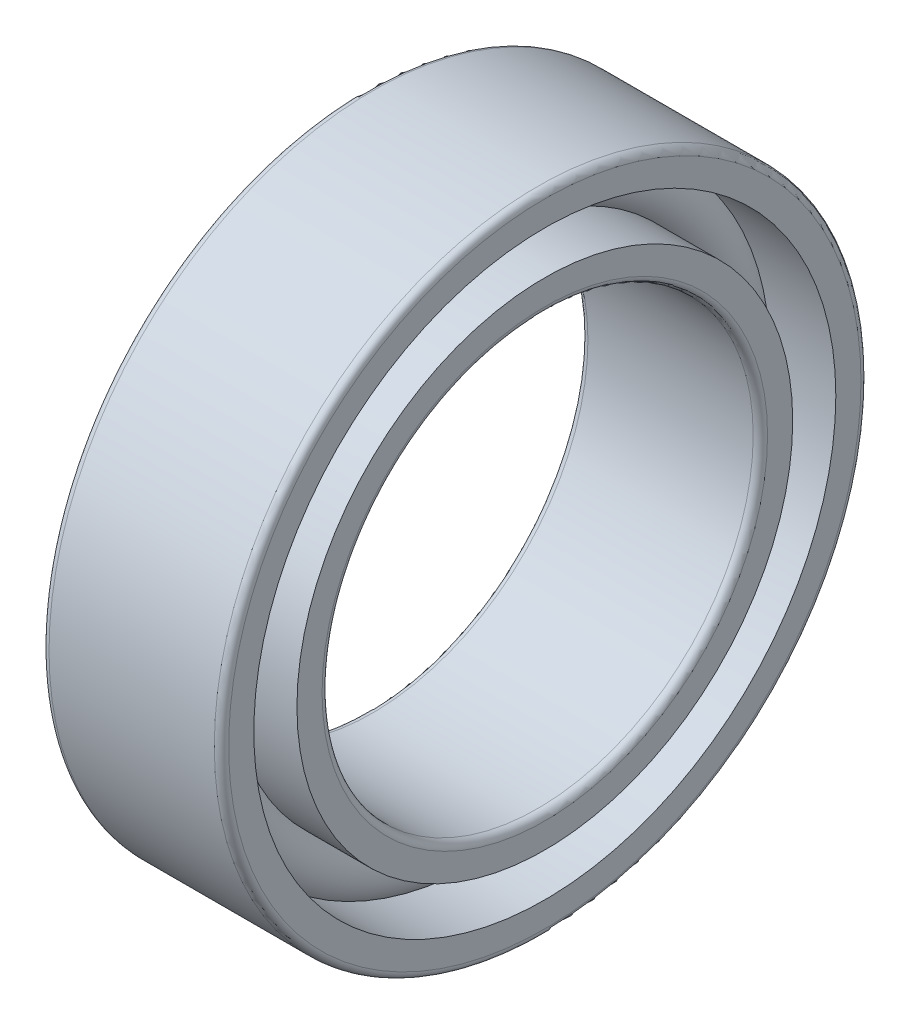
ISO-10303-21;
HEADER;
FILE_DESCRIPTION(('STEP AP214'),'2;1');
FILE_NAME('part.step','',(''),(''),'','','');
FILE_SCHEMA(('AUTOMOTIVE_DESIGN { 1 0 10303 214 1 1 1 1 }'));
ENDSEC;
DATA;
#1=APPLICATION_CONTEXT('core data for automotive mechanical design processes');
#2=APPLICATION_PROTOCOL_DEFINITION('international standard','automotive_design',2000,#1);
#3=PRODUCT_CONTEXT('',#1,'mechanical');
#4=PRODUCT('Part','Part','',(#3));
#5=PRODUCT_RELATED_PRODUCT_CATEGORY('part','',(#4));
#6=PRODUCT_DEFINITION_FORMATION('','',#4);
#7=PRODUCT_DEFINITION_CONTEXT('part definition',#1,'design');
#8=PRODUCT_DEFINITION('design','',#6,#7);
#9=PRODUCT_DEFINITION_SHAPE('','',#8);
#10=(LENGTH_UNIT() NAMED_UNIT(*) SI_UNIT(.MILLI.,.METRE.));
#11=(NAMED_UNIT(*) PLANE_ANGLE_UNIT() SI_UNIT($,.RADIAN.));
#12=(NAMED_UNIT(*) SI_UNIT($,.STERADIAN.) SOLID_ANGLE_UNIT());
#13=UNCERTAINTY_MEASURE_WITH_UNIT(LENGTH_MEASURE(1.E-05),#10,'distance_accuracy_value','');
#14=(GEOMETRIC_REPRESENTATION_CONTEXT(3) GLOBAL_UNCERTAINTY_ASSIGNED_CONTEXT((#13)) GLOBAL_UNIT_ASSIGNED_CONTEXT((#10,
#11,#12)) REPRESENTATION_CONTEXT('',''));
#15=CARTESIAN_POINT('',(0.,0.,0.));
#16=DIRECTION('',(0.,0.,1.));
#17=DIRECTION('',(1.,0.,0.));
#18=AXIS2_PLACEMENT_3D('',#15,#16,#17);
#19=CARTESIAN_POINT('',(-1.80162655706908E-08,0.000298432606224425,-1.31745938614548E-09));
#20=DIRECTION('',(-1.,0.,0.));
#21=DIRECTION('',(0.,0.,1.));
#22=AXIS2_PLACEMENT_3D('',#19,#20,#21);
#23=TOROIDAL_SURFACE('',#22,2.3817391275,0.2858086953);
#24=CARTESIAN_POINT('',(0.213029205734174,0.000298432606224425,-1.31745938614548E-09));
#25=DIRECTION('',(-1.,0.,0.));
#26=DIRECTION('',(0.,0.,1.));
#27=AXIS2_PLACEMENT_3D('',#24,#25,#26);
#28=CIRCLE('',#27,2.5722782577);
#29=CARTESIAN_POINT('',(0.213029205734174,0.000298432606224425,2.57227825638254));
#30=VERTEX_POINT('',#29);
#31=EDGE_CURVE('E42',#30,#30,#28,.F.);
#32=ORIENTED_EDGE('',*,*,#31,.T.);
#33=EDGE_LOOP('',(#32));
#34=FACE_BOUND('',#33,.T.);
#35=CARTESIAN_POINT('',(0.281811156000136,0.000298432606224425,-1.31745938614548E-09));
#36=DIRECTION('',(-1.,0.,0.));
#37=DIRECTION('',(0.,0.,1.));
#38=AXIS2_PLACEMENT_3D('',#35,#36,#37);
#39=CIRCLE('',#38,2.42937391005);
#40=CARTESIAN_POINT('',(0.281811156000833,2.42607115309544,0.132228223211192));
#41=VERTEX_POINT('',#40);
#42=CARTESIAN_POINT('',(0.281811156000136,2.42607115309538,-0.132228225847055));
#43=VERTEX_POINT('',#42);
#44=EDGE_CURVE('E54',#41,#43,#39,.T.);
#45=ORIENTED_EDGE('',*,*,#44,.T.);
#46=CARTESIAN_POINT('',(0.281167144241357,2.42973585569962,-0.132327995103646));
#47=CARTESIAN_POINT('',(0.284100149198315,2.41376618297059,-0.131893517138438));
#48=CARTESIAN_POINT('',(0.285637047352766,2.39754534473115,-0.131449837990503));
#49=CARTESIAN_POINT('',(0.285948333699494,2.36539272467966,-0.130565908961183));
#50=CARTESIAN_POINT('',(0.284775891839199,2.34946145970345,-0.130125760330629));
#51=CARTESIAN_POINT('',(0.280291062901529,2.32107409022271,-0.129337565048585));
#52=CARTESIAN_POINT('',(0.277438443009112,2.30854390709209,-0.128988230972604));
#53=CARTESIAN_POINT('',(0.273742558030363,2.29626817494372,-0.128644523556837));
#54=B_SPLINE_CURVE_WITH_KNOTS('',3,(#46,#47,#48,#49,#50,#51,#52,#53),.UNSPECIFIED.,.F.,.F.,(4,2,
2,4),(0.,0.0486633484844288,0.0963798249911092,0.134830262336285),.UNSPECIFIED.);
#55=CARTESIAN_POINT('',(0.281811156000142,2.33080158799545,-0.129607623914879));
#56=VERTEX_POINT('',#55);
#57=EDGE_CURVE('E81',#43,#56,#54,.T.);
#58=ORIENTED_EDGE('',*,*,#57,.T.);
#59=CARTESIAN_POINT('',(0.281811156000136,0.000298432606224425,-1.31745938614548E-09));
#60=DIRECTION('',(-1.,0.,0.));
#61=DIRECTION('',(0.,0.,1.));
#62=AXIS2_PLACEMENT_3D('',#59,#60,#61);
#63=CIRCLE('',#62,2.33410434495);
#64=CARTESIAN_POINT('',(0.281811156000136,2.33080158799544,0.12960762127997));
#65=VERTEX_POINT('',#64);
#66=EDGE_CURVE('E47',#56,#65,#63,.F.);
#67=ORIENTED_EDGE('',*,*,#66,.T.);
#68=CARTESIAN_POINT('',(0.273742558030363,2.29626817494371,0.128644520921918));
#69=CARTESIAN_POINT('',(0.278428712022317,2.31181398398113,0.129079825714504));
#70=CARTESIAN_POINT('',(0.281755236696182,2.32776426449075,0.12952401154774));
#71=CARTESIAN_POINT('',(0.285630764159104,2.35968396790953,0.130408356608856));
#72=CARTESIAN_POINT('',(0.286232551499178,2.37564697959219,0.130848426016569));
#73=CARTESIAN_POINT('',(0.284923938169938,2.40435664536367,0.131636003282245));
#74=CARTESIAN_POINT('',(0.283478684915354,2.41712592412426,0.131984890796071));
#75=CARTESIAN_POINT('',(0.281167144241359,2.42973585569961,0.132327992468727));
#76=B_SPLINE_CURVE_WITH_KNOTS('',3,(#68,#69,#70,#71,#72,#73,#74,#75),.UNSPECIFIED.,.F.,.F.,(4,2,
2,4),(0.,0.0486633491759087,0.0963798253133486,0.134830262425958),.UNSPECIFIED.);
#77=EDGE_CURVE('E80',#65,#41,#76,.T.);
#78=ORIENTED_EDGE('',*,*,#77,.T.);
#79=EDGE_LOOP('',(#45,#58,#67,#78));
#80=FACE_BOUND('',#79,.T.);
#81=CARTESIAN_POINT('',(0.213029205734176,0.000298432606224425,-1.31745938614548E-09));
#82=DIRECTION('',(-1.,0.,0.));
#83=DIRECTION('',(0.,0.,1.));
#84=AXIS2_PLACEMENT_3D('',#81,#82,#83);
#85=CIRCLE('',#84,2.1911999973);
#86=CARTESIAN_POINT('',(0.213029205734176,0.000298432606224425,2.19119999598254));
#87=VERTEX_POINT('',#86);
#88=EDGE_CURVE('E93',#87,#87,#85,.T.);
#89=ORIENTED_EDGE('',*,*,#88,.T.);
#90=EDGE_LOOP('',(#89));
#91=FACE_BOUND('',#90,.T.);
#92=ADVANCED_FACE('F37',(#34,#80,#91),#23,.T.);
#93=CARTESIAN_POINT('',(-1.80162655706908E-08,2.38203756010622,-1.31745938614548E-09));
#94=DIRECTION('',(1.,0.,0.));
#95=DIRECTION('',(0.,-1.,0.));
#96=AXIS2_PLACEMENT_3D('',#93,#94,#95);
#97=SPHERICAL_SURFACE('',#96,0.31438956483);
#98=ORIENTED_EDGE('',*,*,#57,.F.);
#99=CARTESIAN_POINT('',(-1.80162655706908E-08,2.40939897920294,0.313196664085874));
#100=CARTESIAN_POINT('',(-0.0173115969476488,2.40939923094166,0.313195942687363));
#101=CARTESIAN_POINT('',(-0.034633865728047,2.40958973553445,0.311740024510792));
#102=CARTESIAN_POINT('',(-0.068796002665867,2.41033111358584,0.305954654463721));
#103=CARTESIAN_POINT('',(-0.0856353566222444,2.4108823572935,0.301622250209509));
#104=CARTESIAN_POINT('',(-0.118331987448267,2.41228243774962,0.290212979097694));
#105=CARTESIAN_POINT('',(-0.134189920836021,2.41313107297089,0.283137970420371));
#106=CARTESIAN_POINT('',(-0.164490007648283,2.41503080750561,0.266449511255104));
#107=CARTESIAN_POINT('',(-0.178932415490954,2.41608187033486,0.256836518080921));
#108=CARTESIAN_POINT('',(-0.206084527183535,2.41827593758206,0.235286967569443));
#109=CARTESIAN_POINT('',(-0.218784494501792,2.41941940607635,0.223338191747408));
#110=CARTESIAN_POINT('',(-0.242016552927735,2.42166663269258,0.197488302198498));
#111=CARTESIAN_POINT('',(-0.252548485978641,2.42277038791445,0.183587046253641));
#112=CARTESIAN_POINT('',(-0.271244886738801,2.42482579657287,0.154093256532886));
#113=CARTESIAN_POINT('',(-0.279387973953382,2.42577604409508,0.138487068563399));
#114=CARTESIAN_POINT('',(-0.292965158689501,2.42740729928271,0.106124562405864));
#115=CARTESIAN_POINT('',(-0.298399180026573,2.42808829937622,0.0893682118879696));
#116=CARTESIAN_POINT('',(-0.306433237544128,2.42910830264434,0.055094170538944));
#117=CARTESIAN_POINT('',(-0.309019562575992,2.42944565061817,0.0375732149156469));
#118=CARTESIAN_POINT('',(-0.31124242787047,2.42973507762778,0.00234200759170533));
#119=CARTESIAN_POINT('',(-0.310878942476629,2.4296871533126,-0.0153682457540487));
#120=CARTESIAN_POINT('',(-0.307209687707707,2.42921107320866,-0.0504972455809863));
#121=CARTESIAN_POINT('',(-0.303900464779796,2.42878247111844,-0.0679156254447354));
#122=CARTESIAN_POINT('',(-0.294423413363534,2.42759216979261,-0.101944826941977));
#123=CARTESIAN_POINT('',(-0.288255566110059,2.42683046837041,-0.118555643273516));
#124=CARTESIAN_POINT('',(-0.273229550250315,2.42505943234729,-0.150491312189679));
#125=CARTESIAN_POINT('',(-0.264372296638545,2.42405018199031,-0.165816599879408));
#126=CARTESIAN_POINT('',(-0.244206577436172,2.42189731093565,-0.194749172041799));
#127=CARTESIAN_POINT('',(-0.232898131625548,2.42075369132229,-0.208356470376433));
#128=CARTESIAN_POINT('',(-0.208176520096354,2.41846493479103,-0.233423832177474));
#129=CARTESIAN_POINT('',(-0.194769544118014,2.41731981185718,-0.24488999956105));
#130=CARTESIAN_POINT('',(-0.166200246093705,2.41515503943344,-0.265389835412694));
#131=CARTESIAN_POINT('',(-0.151037993808397,2.41413538496033,-0.274423600505289));
#132=CARTESIAN_POINT('',(-0.119505837369794,2.41234539713407,-0.289734889530915));
#133=CARTESIAN_POINT('',(-0.103145701245619,2.41157327445767,-0.296032317011263));
#134=CARTESIAN_POINT('',(-0.0695868553806398,2.4103564841195,-0.305781204257846));
#135=CARTESIAN_POINT('',(-0.0523881928712574,2.40991179803696,-0.309232824123327));
#136=CARTESIAN_POINT('',(-0.0178037399762175,2.40940331168958,-0.31316966771648));
#137=CARTESIAN_POINT('',(-0.000420952081402655,2.40933617589465,-0.313680869968283));
#138=CARTESIAN_POINT('',(0.0341825729960589,2.40958142721202,-0.311791471532502));
#139=CARTESIAN_POINT('',(0.0514033145104528,2.40989380415016,-0.309390948903878));
#140=CARTESIAN_POINT('',(0.0851363814277606,2.41086103278561,-0.301761660142869));
#141=CARTESIAN_POINT('',(0.101650841304365,2.41151476004003,-0.296542178025454));
#142=CARTESIAN_POINT('',(0.133569223849674,2.41309077146132,-0.283432623464064));
#143=CARTESIAN_POINT('',(0.148973122542898,2.41401306142392,-0.275542493385418));
#144=CARTESIAN_POINT('',(0.178323181399147,2.41602908444771,-0.257269539251667));
#145=CARTESIAN_POINT('',(0.192261308969665,2.41712368765742,-0.246873913166386));
#146=CARTESIAN_POINT('',(0.218208068008811,2.41935936661631,-0.22390751006475));
#147=CARTESIAN_POINT('',(0.230216608467461,2.42050044455432,-0.211336630509479));
#148=CARTESIAN_POINT('',(0.25208170624505,2.42271367267804,-0.184249694137134));
#149=CARTESIAN_POINT('',(0.26191781796257,2.42378510611616,-0.169717072749496));
#150=CARTESIAN_POINT('',(0.279035079786933,2.4257288607362,-0.139205769486519));
#151=CARTESIAN_POINT('',(0.286316140481812,2.42660117494974,-0.123227037030289));
#152=CARTESIAN_POINT('',(0.298167849996299,2.42805519977913,-0.0901661828451813));
#153=CARTESIAN_POINT('',(0.302720946803592,2.42863502479651,-0.073077683704349));
#154=CARTESIAN_POINT('',(0.308922341110226,2.42943125138539,-0.0383732087082003));
#155=CARTESIAN_POINT('',(0.310570590306997,2.42964764691368,-0.0207572240866702));
#156=CARTESIAN_POINT('',(0.310918739235499,2.42969306310972,0.0145418271032817));
#157=CARTESIAN_POINT('',(0.309612390972645,2.42952126287278,0.0322249567374798));
#158=CARTESIAN_POINT('',(0.304073270893546,2.42880769741678,0.067119249291081));
#159=CARTESIAN_POINT('',(0.299840476035089,2.42826592928467,0.0843304084931809));
#160=CARTESIAN_POINT('',(0.288561123317974,2.42687275180725,0.117793652890466));
#161=CARTESIAN_POINT('',(0.281514250312646,2.42602130778251,0.134045630433505));
#162=CARTESIAN_POINT('',(0.264796640152988,2.42410413996459,0.165124730814148));
#163=CARTESIAN_POINT('',(0.255125988812547,2.42303842317977,0.179951900230376));
#164=CARTESIAN_POINT('',(0.233443636598296,2.42081478893868,0.20773139161671));
#165=CARTESIAN_POINT('',(0.221436198519598,2.41965704160691,0.220687053743447));
#166=CARTESIAN_POINT('',(0.195396363727518,2.41737857905888,0.244383415989477));
#167=CARTESIAN_POINT('',(0.181363595372254,2.41625787068564,0.255123708714742));
#168=CARTESIAN_POINT('',(0.151752139581521,2.41418768035421,0.274019039431976));
#169=CARTESIAN_POINT('',(0.136182308976948,2.41323729711826,0.282187869495418));
#170=CARTESIAN_POINT('',(0.103884456138817,2.41161002962923,0.295772217606483));
#171=CARTESIAN_POINT('',(0.0871577298235277,2.41093284497898,0.301190761450364));
#172=CARTESIAN_POINT('',(0.0586202060540398,2.41009255899228,0.307825790374034));
#173=CARTESIAN_POINT('',(0.0469906787196074,2.40983376064677,0.309836971782331));
#174=CARTESIAN_POINT('',(0.0235757468602642,2.40948688576472,0.312522648519098));
#175=CARTESIAN_POINT('',(0.0117903436842732,2.40939880775177,0.313197155407284));
#176=CARTESIAN_POINT('',(-1.80162655706908E-08,2.40939897920294,0.313196664085874));
#177=B_SPLINE_CURVE_WITH_KNOTS('',3,(#99,#100,#101,#102,#103,#104,#105,#106,#107,#108,#109,#110,
#111,#112,#113,#114,#115,#116,#117,#118,#119,#120,#121,#122,#123,#124,#125,#126,#127,#128,#129,
#130,#131,#132,#133,#134,#135,#136,#137,#138,#139,#140,#141,#142,#143,#144,#145,#146,#147,#148,
#149,#150,#151,#152,#153,#154,#155,#156,#157,#158,#159,#160,#161,#162,#163,#164,#165,#166,#167,
#168,#169,#170,#171,#172,#173,#174,#175,#176),.UNSPECIFIED.,.T.,.F.,(4,2,2,2,2,2,2,2,2,2,2,2,2,
2,2,2,2,2,2,2,2,2,2,2,2,2,2,2,2,2,2,2,2,2,2,2,2,2,4),(0.,0.0518916539359982,0.103836651220785,
0.15574651586281,0.207647033358313,0.259826681004319,0.312010131370921,0.364647299192996,
0.417285947196259,0.470176947371838,0.523068407575949,0.576021958981341,0.6289758579994,
0.681911761098405,0.734847237045229,0.787629420890332,0.840409507711335,0.892798980597908,
0.945185505960045,0.997108478049379,1.04903005819278,1.10078167238024,1.15253440347923,
1.20455739464958,1.25658283879154,1.3090788194985,1.36157663707713,1.41440870180371,
1.46724164502743,1.5201864168536,1.57313160556027,1.62608272522562,1.67903211326839,
1.73188580078509,1.78474919915067,1.83732403263365,1.88984089853729,1.9251829469282,
1.96052468967562),.UNSPECIFIED.);
#178=EDGE_CURVE('E89',#43,#41,#177,.T.);
#179=ORIENTED_EDGE('',*,*,#178,.T.);
#180=ORIENTED_EDGE('',*,*,#77,.F.);
#181=CARTESIAN_POINT('',(-1.80162655706908E-08,2.3141294025204,0.306967891395496));
#182=CARTESIAN_POINT('',(0.0175675350719552,2.31412965778904,0.30696721532641));
#183=CARTESIAN_POINT('',(0.0351458123179978,2.31432582537116,0.305498440733564));
#184=CARTESIAN_POINT('',(0.0698176116968814,2.31508944022756,0.299656570228701));
#185=CARTESIAN_POINT('',(0.0869106195946448,2.31565726706895,0.295280505098486));
#186=CARTESIAN_POINT('',(0.120109837142933,2.31710011053106,0.283737074061061));
#187=CARTESIAN_POINT('',(0.136216298538966,2.31797504839684,0.276570423714463));
#188=CARTESIAN_POINT('',(0.166980046883111,2.31993303619323,0.259635716192397));
#189=CARTESIAN_POINT('',(0.18163764585004,2.32101604116716,0.249868220801169));
#190=CARTESIAN_POINT('',(0.209035923262982,2.32326320928371,0.228029549317636));
#191=CARTESIAN_POINT('',(0.221782816683811,2.32442709044365,0.215966145197438));
#192=CARTESIAN_POINT('',(0.245042054423211,2.32670635611369,0.189844002796366));
#193=CARTESIAN_POINT('',(0.25555443960651,2.32782174151038,0.175785301013375));
#194=CARTESIAN_POINT('',(0.273932069323723,2.32986474271891,0.146221967830949));
#195=CARTESIAN_POINT('',(0.281823477562753,2.33079417513577,0.130733730574025));
#196=CARTESIAN_POINT('',(0.294867730618462,2.33237326116145,0.0986306978592593));
#197=CARTESIAN_POINT('',(0.300020799932331,2.33302293770465,0.0820159948784058));
#198=CARTESIAN_POINT('',(0.307381649380845,2.33396156114385,0.0483637399019595));
#199=CARTESIAN_POINT('',(0.30962687385769,2.33425509096509,0.0313345008730716));
#200=CARTESIAN_POINT('',(0.311227031832824,2.33446362769086,-0.00286111466907558));
#201=CARTESIAN_POINT('',(0.310582124403033,2.33437865542803,-0.0200274835828385));
#202=CARTESIAN_POINT('',(0.306437625556895,2.33384187658979,-0.05387577542869));
#203=CARTESIAN_POINT('',(0.302959280530536,2.33339280034667,-0.070560350165652));
#204=CARTESIAN_POINT('',(0.293279138474662,2.33218122865491,-0.103107248254497));
#205=CARTESIAN_POINT('',(0.287077316589159,2.33141873034582,-0.118969564100504));
#206=CARTESIAN_POINT('',(0.272104651748099,2.32966112679747,-0.14949023005968));
#207=CARTESIAN_POINT('',(0.263324327539243,2.32866516588405,-0.16414387650422));
#208=CARTESIAN_POINT('',(0.243457951407391,2.32655172753734,-0.191784160475659));
#209=CARTESIAN_POINT('',(0.232371768891622,2.32543424322325,-0.204770703518408));
#210=CARTESIAN_POINT('',(0.208063165575671,2.32318606672279,-0.228877149372685));
#211=CARTESIAN_POINT('',(0.194816887365836,2.32205537565323,-0.239972993066117));
#212=CARTESIAN_POINT('',(0.16665984499958,2.31991879325477,-0.259816062571192));
#213=CARTESIAN_POINT('',(0.151748973695452,2.31891290996839,-0.268563137072047));
#214=CARTESIAN_POINT('',(0.120491674869566,2.31712541879222,-0.283573465951737));
#215=CARTESIAN_POINT('',(0.104130196140267,2.31634664053373,-0.289805725619848));
#216=CARTESIAN_POINT('',(0.0705891079928695,2.31511644793639,-0.299473833034374));
#217=CARTESIAN_POINT('',(0.0534094648963042,2.31466504708595,-0.302909565560588));
#218=CARTESIAN_POINT('',(0.0185962413768447,2.31413800687621,-0.306909958308506));
#219=CARTESIAN_POINT('',(0.000960389405553631,2.31406490770856,-0.307455210342443));
#220=CARTESIAN_POINT('',(-0.0341542877652378,2.31430957473159,-0.305608164522144));
#221=CARTESIAN_POINT('',(-0.0516331100613229,2.31462734813442,-0.303215812464932));
#222=CARTESIAN_POINT('',(-0.0859659197197488,2.31561883898037,-0.295549192683506));
#223=CARTESIAN_POINT('',(-0.102818871147906,2.31629312066261,-0.290270356118959));
#224=CARTESIAN_POINT('',(-0.135389045484882,2.31792175391287,-0.276965502346925));
#225=CARTESIAN_POINT('',(-0.151106270471556,2.31887610496848,-0.268939490165658));
#226=CARTESIAN_POINT('',(-0.1809112313187,2.32095363758636,-0.250378030614007));
#227=CARTESIAN_POINT('',(-0.19500320968069,2.32207636113871,-0.239849346947583));
#228=CARTESIAN_POINT('',(-0.22119456433876,2.3243646176008,-0.216554912414675));
#229=CARTESIAN_POINT('',(-0.233294015415018,2.32553014890194,-0.203789245540007));
#230=CARTESIAN_POINT('',(-0.255049055216084,2.32776069421281,-0.176488470556612));
#231=CARTESIAN_POINT('',(-0.264724100186036,2.32882646242954,-0.161968933288749));
#232=CARTESIAN_POINT('',(-0.281469199949721,2.33074636217217,-0.131485294865465));
#233=CARTESIAN_POINT('',(-0.28853945440057,2.33160050991711,-0.115521304544214));
#234=CARTESIAN_POINT('',(-0.29978538383621,2.33298955088697,-0.0828215661944799));
#235=CARTESIAN_POINT('',(-0.303997134628122,2.33352841074486,-0.066098392151395));
#236=CARTESIAN_POINT('',(-0.30954281262776,2.33424263965587,-0.0321741784264121));
#237=CARTESIAN_POINT('',(-0.310876933507378,2.33441803317117,-0.0149731709828588));
#238=CARTESIAN_POINT('',(-0.310628090202559,2.33438558479734,0.0192294253957364));
#239=CARTESIAN_POINT('',(-0.309075020282243,2.33418167028861,0.0362312440318496));
#240=CARTESIAN_POINT('',(-0.303157461134227,2.33342115687403,0.0697297064743237));
#241=CARTESIAN_POINT('',(-0.298793005434435,2.33286456217416,0.0862263563027481));
#242=CARTESIAN_POINT('',(-0.287384028488137,2.33146071310853,0.118247819096649));
#243=CARTESIAN_POINT('',(-0.280339989794013,2.33061351107945,0.133772806457973));
#244=CARTESIAN_POINT('',(-0.263778324902718,2.32872184202991,0.163427584573718));
#245=CARTESIAN_POINT('',(-0.25426066948002,2.32767737267881,0.177557358841118));
#246=CARTESIAN_POINT('',(-0.232919298040675,2.32549437297419,0.20417471431095));
#247=CARTESIAN_POINT('',(-0.22107380651124,2.32435501800344,0.216644763288975));
#248=CARTESIAN_POINT('',(-0.195472273332559,2.32211640586736,0.239449476433124));
#249=CARTESIAN_POINT('',(-0.181715712610552,2.32101715969891,0.249783558537542));
#250=CARTESIAN_POINT('',(-0.152487313137704,2.31896541326869,0.268166870024956));
#251=CARTESIAN_POINT('',(-0.136995178733704,2.31801504820977,0.276184042356554));
#252=CARTESIAN_POINT('',(-0.104893955622862,2.31638533593657,0.28953436695447));
#253=CARTESIAN_POINT('',(-0.088285945061707,2.31570573139508,0.294870068921759));
#254=CARTESIAN_POINT('',(-0.0596714712959137,2.31484810819749,0.301512873841384));
#255=CARTESIAN_POINT('',(-0.0478330366450396,2.31457992941309,0.303555888519541));
#256=CARTESIAN_POINT('',(-0.0239980764500028,2.31422048875477,0.306283633024605));
#257=CARTESIAN_POINT('',(-0.0120015497903197,2.31412922812988,0.306968353262016));
#258=CARTESIAN_POINT('',(-1.80162655706908E-08,2.3141294025204,0.306967891395496));
#259=B_SPLINE_CURVE_WITH_KNOTS('',3,(#181,#182,#183,#184,#185,#186,#187,#188,#189,#190,#191,
#192,#193,#194,#195,#196,#197,#198,#199,#200,#201,#202,#203,#204,#205,#206,#207,#208,#209,#210,
#211,#212,#213,#214,#215,#216,#217,#218,#219,#220,#221,#222,#223,#224,#225,#226,#227,#228,#229,
#230,#231,#232,#233,#234,#235,#236,#237,#238,#239,#240,#241,#242,#243,#244,#245,#246,#247,#248,
#249,#250,#251,#252,#253,#254,#255,#256,#257,#258),.UNSPECIFIED.,.T.,.F.,(4,2,2,2,2,2,2,2,2,2,2,
2,2,2,2,2,2,2,2,2,2,2,2,2,2,2,2,2,2,2,2,2,2,2,2,2,2,2,4),(0.,0.0526592671418403,
0.105372398081969,0.158072021236285,0.210760270458289,0.263273236758981,0.315785242618938,
0.367756084976919,0.419722665952687,0.471013192414255,0.522300895896608,0.573207523041225,
0.624114614798114,0.67521128914105,0.726310858143294,0.778018678178517,0.829729828500494,
0.882060155121029,0.934392637703309,0.987076066766496,1.03976046792851,1.09252850243046,
1.14529644038881,1.19792335779895,1.25054829965391,1.3027363203164,1.35492033993599,
1.40643287310429,1.45794193923846,1.50892064337,1.55989873955308,1.61086765969452,
1.66183718205585,1.71330837512658,1.76479357591735,1.81696032126533,1.86907736908025,
1.90505206645792,1.94102701781441),.UNSPECIFIED.);
#260=EDGE_CURVE('E86',#65,#56,#259,.T.);
#261=ORIENTED_EDGE('',*,*,#260,.T.);
#262=EDGE_LOOP('',(#98,#179,#180,#261));
#263=FACE_BOUND('',#262,.T.);
#264=ADVANCED_FACE('F92',(#263),#97,.T.);
#265=CARTESIAN_POINT('',(-6.55375218385377,0.000298432606224425,-1.31745938614548E-09));
#266=DIRECTION('',(1.,0.,0.));
#267=DIRECTION('',(0.,0.,-1.));
#268=AXIS2_PLACEMENT_3D('',#265,#266,#267);
#269=CYLINDRICAL_SURFACE('',#268,2.42937391005);
#270=ORIENTED_EDGE('',*,*,#44,.F.);
#271=ORIENTED_EDGE('',*,*,#178,.F.);
#272=EDGE_LOOP('',(#270,#271));
#273=FACE_BOUND('',#272,.T.);
#274=ADVANCED_FACE('F156',(#273),#269,.T.);
#275=CARTESIAN_POINT('',(-6.55375218385377,0.000298432606224425,-1.31745938614548E-09));
#276=DIRECTION('',(1.,0.,0.));
#277=DIRECTION('',(0.,0.,-1.));
#278=AXIS2_PLACEMENT_3D('',#275,#276,#277);
#279=CYLINDRICAL_SURFACE('',#278,2.33410434495);
#280=ORIENTED_EDGE('',*,*,#66,.F.);
#281=ORIENTED_EDGE('',*,*,#260,.F.);
#282=EDGE_LOOP('',(#280,#281));
#283=FACE_BOUND('',#282,.T.);
#284=ADVANCED_FACE('F87',(#283),#279,.F.);
#285=CARTESIAN_POINT('',(-0.213029241766705,0.000298432606224425,-1.31745938614548E-09));
#286=DIRECTION('',(1.,0.,0.));
#287=DIRECTION('',(0.,0.,-1.));
#288=AXIS2_PLACEMENT_3D('',#285,#286,#287);
#289=CIRCLE('',#288,2.5722782577);
#290=CARTESIAN_POINT('',(-0.213029241766705,0.000298432606224425,-2.57227825901746));
#291=VERTEX_POINT('',#290);
#292=EDGE_CURVE('E167',#291,#291,#289,.F.);
#293=ORIENTED_EDGE('',*,*,#292,.T.);
#294=EDGE_LOOP('',(#293));
#295=FACE_BOUND('',#294,.T.);
#296=CARTESIAN_POINT('',(-0.213029241766707,0.000298432606224425,-1.31745938614548E-09));
#297=DIRECTION('',(1.,0.,0.));
#298=DIRECTION('',(0.,0.,-1.));
#299=AXIS2_PLACEMENT_3D('',#296,#297,#298);
#300=CIRCLE('',#299,2.1911999973);
#301=CARTESIAN_POINT('',(-0.213029241766707,0.000298432606224425,-2.19119999861746));
#302=VERTEX_POINT('',#301);
#303=EDGE_CURVE('E97',#302,#302,#300,.T.);
#304=ORIENTED_EDGE('',*,*,#303,.T.);
#305=EDGE_LOOP('',(#304));
#306=FACE_BOUND('',#305,.T.);
#307=CARTESIAN_POINT('',(-0.281811192032667,0.000298432606224425,-1.31745938614548E-09));
#308=DIRECTION('',(1.,0.,0.));
#309=DIRECTION('',(0.,0.,-1.));
#310=AXIS2_PLACEMENT_3D('',#307,#308,#309);
#311=CIRCLE('',#310,2.42937391005);
#312=CARTESIAN_POINT('',(-0.281811192032667,2.42607115309544,-0.132228225845939));
#313=VERTEX_POINT('',#312);
#314=CARTESIAN_POINT('',(-0.281811192032667,2.42607115309539,0.132228223212098));
#315=VERTEX_POINT('',#314);
#316=EDGE_CURVE('E141',#313,#315,#311,.T.);
#317=ORIENTED_EDGE('',*,*,#316,.T.);
#318=CARTESIAN_POINT('',(-0.28116718027389,2.42973585569961,0.132327992468727));
#319=CARTESIAN_POINT('',(-0.284100185230847,2.41376618297058,0.131893514503519));
#320=CARTESIAN_POINT('',(-0.285637083385298,2.39754534473114,0.131449835355584));
#321=CARTESIAN_POINT('',(-0.285948369732025,2.36539272467965,0.130565906326264));
#322=CARTESIAN_POINT('',(-0.284775927871729,2.34946145970344,0.13012575769571));
#323=CARTESIAN_POINT('',(-0.280291098934059,2.3210740902227,0.129337562413666));
#324=CARTESIAN_POINT('',(-0.277438479041642,2.30854390709208,0.128988228337685));
#325=CARTESIAN_POINT('',(-0.273742594062894,2.29626817494371,0.128644520921918));
#326=B_SPLINE_CURVE_WITH_KNOTS('',3,(#318,#319,#320,#321,#322,#323,#324,#325),.UNSPECIFIED.,.F.,
.F.,(4,2,2,4),(0.,0.0486633484844291,0.0963798249911091,0.134830262336274),.UNSPECIFIED.);
#327=CARTESIAN_POINT('',(-0.281811192032667,2.3308015879954,0.129607621282444));
#328=VERTEX_POINT('',#327);
#329=EDGE_CURVE('E134',#315,#328,#326,.T.);
#330=ORIENTED_EDGE('',*,*,#329,.T.);
#331=CARTESIAN_POINT('',(-0.281811192032667,0.000298432606224425,-1.31745938614548E-09));
#332=DIRECTION('',(1.,0.,0.));
#333=DIRECTION('',(0.,0.,-1.));
#334=AXIS2_PLACEMENT_3D('',#331,#332,#333);
#335=CIRCLE('',#334,2.33410434495);
#336=CARTESIAN_POINT('',(-0.281811192032667,2.33080158799544,-0.129607623914888));
#337=VERTEX_POINT('',#336);
#338=EDGE_CURVE('E11',#328,#337,#335,.F.);
#339=ORIENTED_EDGE('',*,*,#338,.T.);
#340=CARTESIAN_POINT('',(-0.273742594062894,2.29626817494372,-0.128644523556837));
#341=CARTESIAN_POINT('',(-0.278428748054848,2.31181398398113,-0.129079828349423));
#342=CARTESIAN_POINT('',(-0.281755272728714,2.32776426449075,-0.129524014182658));
#343=CARTESIAN_POINT('',(-0.285630800191635,2.35968396790953,-0.130408359243774));
#344=CARTESIAN_POINT('',(-0.286232587531709,2.37564697959219,-0.130848428651487));
#345=CARTESIAN_POINT('',(-0.284923974202469,2.40435664536368,-0.131636005917164));
#346=CARTESIAN_POINT('',(-0.283478720947884,2.41712592412427,-0.13198489343099));
#347=CARTESIAN_POINT('',(-0.281167180273888,2.42973585569962,-0.132327995103646));
#348=B_SPLINE_CURVE_WITH_KNOTS('',3,(#340,#341,#342,#343,#344,#345,#346,#347),.UNSPECIFIED.,.F.,
.F.,(4,2,2,4),(0.,0.0486633491759087,0.0963798253133481,0.134830262425968),.UNSPECIFIED.);
#349=EDGE_CURVE('E128',#337,#313,#348,.T.);
#350=ORIENTED_EDGE('',*,*,#349,.T.);
#351=EDGE_LOOP('',(#317,#330,#339,#350));
#352=FACE_BOUND('',#351,.T.);
#353=ADVANCED_FACE('F112',(#295,#306,#352),#23,.T.);
#354=ORIENTED_EDGE('',*,*,#338,.F.);
#355=EDGE_CURVE('E90',#337,#328,#259,.T.);
#356=ORIENTED_EDGE('',*,*,#355,.F.);
#357=EDGE_LOOP('',(#354,#356));
#358=FACE_BOUND('',#357,.T.);
#359=ADVANCED_FACE('F117',(#358),#279,.F.);
#360=ORIENTED_EDGE('',*,*,#316,.F.);
#361=EDGE_CURVE('E84',#315,#313,#177,.T.);
#362=ORIENTED_EDGE('',*,*,#361,.F.);
#363=EDGE_LOOP('',(#360,#362));
#364=FACE_BOUND('',#363,.T.);
#365=ADVANCED_FACE('F121',(#364),#269,.T.);
#366=ORIENTED_EDGE('',*,*,#329,.F.);
#367=ORIENTED_EDGE('',*,*,#361,.T.);
#368=ORIENTED_EDGE('',*,*,#349,.F.);
#369=ORIENTED_EDGE('',*,*,#355,.T.);
#370=EDGE_LOOP('',(#366,#367,#368,#369));
#371=FACE_BOUND('',#370,.T.);
#372=ADVANCED_FACE('F39',(#371),#97,.T.);
#373=CARTESIAN_POINT('',(-6.55375218385377,0.000298432606224425,-1.31745938614548E-09));
#374=DIRECTION('',(1.,0.,0.));
#375=DIRECTION('',(0.,0.,-1.));
#376=AXIS2_PLACEMENT_3D('',#373,#374,#375);
#377=CYLINDRICAL_SURFACE('',#376,2.1911999973);
#378=CARTESIAN_POINT('',(0.793913024483734,0.000298432606224425,-1.31745938614548E-09));
#379=DIRECTION('',(1.,0.,0.));
#380=DIRECTION('',(0.,0.,-1.));
#381=AXIS2_PLACEMENT_3D('',#378,#379,#380);
#382=CIRCLE('',#381,2.1911999973);
#383=CARTESIAN_POINT('',(0.793913024483734,0.000298432606224425,-2.19119999861746));
#384=VERTEX_POINT('',#383);
#385=EDGE_CURVE('E105',#384,#384,#382,.T.);
#386=ORIENTED_EDGE('',*,*,#385,.F.);
#387=EDGE_LOOP('',(#386));
#388=FACE_BOUND('',#387,.T.);
#389=ORIENTED_EDGE('',*,*,#88,.F.);
#390=EDGE_LOOP('',(#389));
#391=FACE_BOUND('',#390,.T.);
#392=ADVANCED_FACE('F119',(#388,#391),#377,.T.);
#393=CARTESIAN_POINT('',(-6.55375218385377,0.000298432606224425,-1.31745938614548E-09));
#394=DIRECTION('',(1.,0.,0.));
#395=DIRECTION('',(0.,0.,-1.));
#396=AXIS2_PLACEMENT_3D('',#393,#394,#395);
#397=CYLINDRICAL_SURFACE('',#396,2.1911999973);
#398=CARTESIAN_POINT('',(-0.793913060516265,0.000298432606224425,-1.31745938614548E-09));
#399=DIRECTION('',(1.,0.,0.));
#400=DIRECTION('',(0.,0.,-1.));
#401=AXIS2_PLACEMENT_3D('',#398,#399,#400);
#402=CIRCLE('',#401,2.1911999973);
#403=CARTESIAN_POINT('',(-0.793913060516265,0.000298432606224425,-2.19119999861746));
#404=VERTEX_POINT('',#403);
#405=EDGE_CURVE('E166',#404,#404,#402,.T.);
#406=ORIENTED_EDGE('',*,*,#405,.T.);
#407=EDGE_LOOP('',(#406));
#408=FACE_BOUND('',#407,.T.);
#409=ORIENTED_EDGE('',*,*,#303,.F.);
#410=EDGE_LOOP('',(#409));
#411=FACE_BOUND('',#410,.T.);
#412=ADVANCED_FACE('F245',(#408,#411),#397,.T.);
#413=CARTESIAN_POINT('',(0.793913024483735,1.96920277800622,-1.31745938614548E-09));
#414=DIRECTION('',(1.,0.,0.));
#415=DIRECTION('',(0.,0.,-1.));
#416=AXIS2_PLACEMENT_3D('',#413,#414,#415);
#417=PLANE('',#416);
#418=ORIENTED_EDGE('',*,*,#385,.T.);
#419=EDGE_LOOP('',(#418));
#420=FACE_BOUND('',#419,.T.);
#421=CARTESIAN_POINT('',(0.793913024483734,0.000298432606224425,-1.31745938614548E-09));
#422=DIRECTION('',(1.,0.,0.));
#423=DIRECTION('',(0.,0.,-1.));
#424=AXIS2_PLACEMENT_3D('',#421,#422,#423);
#425=CIRCLE('',#424,1.9689043454);
#426=CARTESIAN_POINT('',(0.793913024483734,0.000298432606224425,-1.96890434671746));
#427=VERTEX_POINT('',#426);
#428=EDGE_CURVE('E182',#427,#427,#425,.T.);
#429=ORIENTED_EDGE('',*,*,#428,.F.);
#430=EDGE_LOOP('',(#429));
#431=FACE_BOUND('',#430,.T.);
#432=ADVANCED_FACE('F248',(#420,#431),#417,.T.);
#433=CARTESIAN_POINT('',(0.730399981083734,0.000298432606224425,-1.31745938614548E-09));
#434=DIRECTION('',(1.,0.,0.));
#435=DIRECTION('',(0.,0.,-1.));
#436=AXIS2_PLACEMENT_3D('',#433,#434,#435);
#437=TOROIDAL_SURFACE('',#436,1.9689043454,0.0635130434000001);
#438=ORIENTED_EDGE('',*,*,#428,.T.);
#439=EDGE_LOOP('',(#438));
#440=FACE_BOUND('',#439,.T.);
#441=CARTESIAN_POINT('',(0.730399981083734,0.000298432606224425,-1.31745938614548E-09));
#442=DIRECTION('',(1.,0.,0.));
#443=DIRECTION('',(0.,0.,-1.));
#444=AXIS2_PLACEMENT_3D('',#441,#442,#443);
#445=CIRCLE('',#444,1.905391302);
#446=CARTESIAN_POINT('',(0.730399981083734,0.000298432606224425,-1.90539130331746));
#447=VERTEX_POINT('',#446);
#448=EDGE_CURVE('E186',#447,#447,#445,.T.);
#449=ORIENTED_EDGE('',*,*,#448,.F.);
#450=EDGE_LOOP('',(#449));
#451=FACE_BOUND('',#450,.T.);
#452=ADVANCED_FACE('F260',(#440,#451),#437,.T.);
#453=CARTESIAN_POINT('',(-6.55375218385377,0.000298432606224425,-1.31745938614548E-09));
#454=DIRECTION('',(1.,0.,0.));
#455=DIRECTION('',(0.,0.,-1.));
#456=AXIS2_PLACEMENT_3D('',#453,#454,#455);
#457=CYLINDRICAL_SURFACE('',#456,1.905391302);
#458=ORIENTED_EDGE('',*,*,#448,.T.);
#459=EDGE_LOOP('',(#458));
#460=FACE_BOUND('',#459,.T.);
#461=CARTESIAN_POINT('',(-0.730400017116266,0.000298432606224425,-1.31745938614548E-09));
#462=DIRECTION('',(1.,0.,0.));
#463=DIRECTION('',(0.,0.,-1.));
#464=AXIS2_PLACEMENT_3D('',#461,#462,#463);
#465=CIRCLE('',#464,1.905391302);
#466=CARTESIAN_POINT('',(-0.730400017116266,0.000298432606224425,-1.90539130331746));
#467=VERTEX_POINT('',#466);
#468=EDGE_CURVE('E190',#467,#467,#465,.T.);
#469=ORIENTED_EDGE('',*,*,#468,.F.);
#470=EDGE_LOOP('',(#469));
#471=FACE_BOUND('',#470,.T.);
#472=ADVANCED_FACE('F256',(#460,#471),#457,.F.);
#473=CARTESIAN_POINT('',(-0.730400017116266,0.000298432606224425,-1.31745938614548E-09));
#474=DIRECTION('',(1.,0.,0.));
#475=DIRECTION('',(0.,0.,-1.));
#476=AXIS2_PLACEMENT_3D('',#473,#474,#475);
#477=TOROIDAL_SURFACE('',#476,1.9689043454,0.0635130434000001);
#478=ORIENTED_EDGE('',*,*,#468,.T.);
#479=EDGE_LOOP('',(#478));
#480=FACE_BOUND('',#479,.T.);
#481=CARTESIAN_POINT('',(-0.793913060516265,0.000298432606224425,-1.31745938614548E-09));
#482=DIRECTION('',(1.,0.,0.));
#483=DIRECTION('',(0.,0.,-1.));
#484=AXIS2_PLACEMENT_3D('',#481,#482,#483);
#485=CIRCLE('',#484,1.9689043454);
#486=CARTESIAN_POINT('',(-0.793913060516265,0.000298432606224425,-1.96890434671746));
#487=VERTEX_POINT('',#486);
#488=EDGE_CURVE('E169',#487,#487,#485,.T.);
#489=ORIENTED_EDGE('',*,*,#488,.F.);
#490=EDGE_LOOP('',(#489));
#491=FACE_BOUND('',#490,.T.);
#492=ADVANCED_FACE('F252',(#480,#491),#477,.T.);
#493=CARTESIAN_POINT('',(-0.793913060516266,2.19149842990622,-1.31745938614548E-09));
#494=DIRECTION('',(-1.,0.,0.));
#495=DIRECTION('',(0.,0.,1.));
#496=AXIS2_PLACEMENT_3D('',#493,#494,#495);
#497=PLANE('',#496);
#498=ORIENTED_EDGE('',*,*,#488,.T.);
#499=EDGE_LOOP('',(#498));
#500=FACE_BOUND('',#499,.T.);
#501=ORIENTED_EDGE('',*,*,#405,.F.);
#502=EDGE_LOOP('',(#501));
#503=FACE_BOUND('',#502,.T.);
#504=ADVANCED_FACE('F228',(#500,#503),#497,.T.);
#505=CARTESIAN_POINT('',(-6.55375218385376,0.000298432606224425,-1.31745938614548E-09));
#506=DIRECTION('',(1.,0.,0.));
#507=DIRECTION('',(0.,0.,-1.));
#508=AXIS2_PLACEMENT_3D('',#505,#506,#507);
#509=CYLINDRICAL_SURFACE('',#508,2.5722782577);
#510=CARTESIAN_POINT('',(0.793913024483734,0.000298432606224425,-1.31745938614548E-09));
#511=DIRECTION('',(1.,0.,0.));
#512=DIRECTION('',(0.,0.,-1.));
#513=AXIS2_PLACEMENT_3D('',#510,#511,#512);
#514=CIRCLE('',#513,2.5722782577);
#515=CARTESIAN_POINT('',(0.793913024483734,0.000298432606224425,-2.57227825901746));
#516=VERTEX_POINT('',#515);
#517=EDGE_CURVE('E172',#516,#516,#514,.T.);
#518=ORIENTED_EDGE('',*,*,#517,.T.);
#519=EDGE_LOOP('',(#518));
#520=FACE_BOUND('',#519,.T.);
#521=ORIENTED_EDGE('',*,*,#31,.F.);
#522=EDGE_LOOP('',(#521));
#523=FACE_BOUND('',#522,.T.);
#524=ADVANCED_FACE('F219',(#520,#523),#509,.F.);
#525=CARTESIAN_POINT('',(-6.55375218385376,0.000298432606224425,-1.31745938614548E-09));
#526=DIRECTION('',(1.,0.,0.));
#527=DIRECTION('',(0.,0.,-1.));
#528=AXIS2_PLACEMENT_3D('',#525,#526,#527);
#529=CYLINDRICAL_SURFACE('',#528,2.5722782577);
#530=CARTESIAN_POINT('',(-0.793913060516265,0.000298432606224425,-1.31745938614548E-09));
#531=DIRECTION('',(1.,0.,0.));
#532=DIRECTION('',(0.,0.,-1.));
#533=AXIS2_PLACEMENT_3D('',#530,#531,#532);
#534=CIRCLE('',#533,2.5722782577);
#535=CARTESIAN_POINT('',(-0.793913060516265,0.000298432606224425,-2.57227825901746));
#536=VERTEX_POINT('',#535);
#537=EDGE_CURVE('E208',#536,#536,#534,.T.);
#538=ORIENTED_EDGE('',*,*,#537,.F.);
#539=EDGE_LOOP('',(#538));
#540=FACE_BOUND('',#539,.T.);
#541=ORIENTED_EDGE('',*,*,#292,.F.);
#542=EDGE_LOOP('',(#541));
#543=FACE_BOUND('',#542,.T.);
#544=ADVANCED_FACE('F215',(#540,#543),#529,.F.);
#545=CARTESIAN_POINT('',(0.793913024483734,2.79487234220623,-1.31745938614548E-09));
#546=DIRECTION('',(1.,0.,0.));
#547=DIRECTION('',(0.,0.,-1.));
#548=AXIS2_PLACEMENT_3D('',#545,#546,#547);
#549=PLANE('',#548);
#550=CARTESIAN_POINT('',(0.793913024483734,0.000298432606224425,-1.31745938614548E-09));
#551=DIRECTION('',(1.,0.,0.));
#552=DIRECTION('',(0.,0.,-1.));
#553=AXIS2_PLACEMENT_3D('',#550,#551,#552);
#554=CIRCLE('',#553,2.7945739096);
#555=CARTESIAN_POINT('',(0.793913024483734,0.000298432606224425,-2.79457391091746));
#556=VERTEX_POINT('',#555);
#557=EDGE_CURVE('E175',#556,#556,#554,.T.);
#558=ORIENTED_EDGE('',*,*,#557,.T.);
#559=EDGE_LOOP('',(#558));
#560=FACE_BOUND('',#559,.T.);
#561=ORIENTED_EDGE('',*,*,#517,.F.);
#562=EDGE_LOOP('',(#561));
#563=FACE_BOUND('',#562,.T.);
#564=ADVANCED_FACE('F218',(#560,#563),#549,.T.);
#565=CARTESIAN_POINT('',(0.730399981083734,0.000298432606224425,-1.31745938614548E-09));
#566=DIRECTION('',(1.,0.,0.));
#567=DIRECTION('',(0.,0.,-1.));
#568=AXIS2_PLACEMENT_3D('',#565,#566,#567);
#569=TOROIDAL_SURFACE('',#568,2.7945739096,0.0635130433999999);
#570=CARTESIAN_POINT('',(0.730399981083734,0.000298432606224425,-1.31745938614548E-09));
#571=DIRECTION('',(1.,0.,0.));
#572=DIRECTION('',(0.,0.,-1.));
#573=AXIS2_PLACEMENT_3D('',#570,#571,#572);
#574=CIRCLE('',#573,2.858086953);
#575=CARTESIAN_POINT('',(0.730399981083734,0.000298432606224425,-2.85808695431746));
#576=VERTEX_POINT('',#575);
#577=EDGE_CURVE('E199',#576,#576,#574,.T.);
#578=ORIENTED_EDGE('',*,*,#577,.T.);
#579=EDGE_LOOP('',(#578));
#580=FACE_BOUND('',#579,.T.);
#581=ORIENTED_EDGE('',*,*,#557,.F.);
#582=EDGE_LOOP('',(#581));
#583=FACE_BOUND('',#582,.T.);
#584=ADVANCED_FACE('F225',(#580,#583),#569,.T.);
#585=CARTESIAN_POINT('',(-6.55375218385376,0.000298432606224425,-1.31745938614548E-09));
#586=DIRECTION('',(1.,0.,0.));
#587=DIRECTION('',(0.,0.,-1.));
#588=AXIS2_PLACEMENT_3D('',#585,#586,#587);
#589=CYLINDRICAL_SURFACE('',#588,2.858086953);
#590=CARTESIAN_POINT('',(-0.730400017116266,0.000298432606224425,-1.31745938614548E-09));
#591=DIRECTION('',(1.,0.,0.));
#592=DIRECTION('',(0.,0.,-1.));
#593=AXIS2_PLACEMENT_3D('',#590,#591,#592);
#594=CIRCLE('',#593,2.858086953);
#595=CARTESIAN_POINT('',(-0.730400017116266,0.000298432606224425,-2.85808695431746));
#596=VERTEX_POINT('',#595);
#597=EDGE_CURVE('E202',#596,#596,#594,.T.);
#598=ORIENTED_EDGE('',*,*,#597,.T.);
#599=EDGE_LOOP('',(#598));
#600=FACE_BOUND('',#599,.T.);
#601=ORIENTED_EDGE('',*,*,#577,.F.);
#602=EDGE_LOOP('',(#601));
#603=FACE_BOUND('',#602,.T.);
#604=ADVANCED_FACE('F237',(#600,#603),#589,.T.);
#605=CARTESIAN_POINT('',(-0.730400017116265,0.000298432606224425,-1.31745938614548E-09));
#606=DIRECTION('',(1.,0.,0.));
#607=DIRECTION('',(0.,0.,-1.));
#608=AXIS2_PLACEMENT_3D('',#605,#606,#607);
#609=TOROIDAL_SURFACE('',#608,2.7945739096,0.0635130433999999);
#610=CARTESIAN_POINT('',(-0.793913060516265,0.000298432606224425,-1.31745938614548E-09));
#611=DIRECTION('',(1.,0.,0.));
#612=DIRECTION('',(0.,0.,-1.));
#613=AXIS2_PLACEMENT_3D('',#610,#611,#612);
#614=CIRCLE('',#613,2.7945739096);
#615=CARTESIAN_POINT('',(-0.793913060516265,0.000298432606224425,-2.79457391091746));
#616=VERTEX_POINT('',#615);
#617=EDGE_CURVE('E205',#616,#616,#614,.T.);
#618=ORIENTED_EDGE('',*,*,#617,.T.);
#619=EDGE_LOOP('',(#618));
#620=FACE_BOUND('',#619,.T.);
#621=ORIENTED_EDGE('',*,*,#597,.F.);
#622=EDGE_LOOP('',(#621));
#623=FACE_BOUND('',#622,.T.);
#624=ADVANCED_FACE('F234',(#620,#623),#609,.T.);
#625=CARTESIAN_POINT('',(-0.793913060516265,2.57257669030623,-1.31745938614548E-09));
#626=DIRECTION('',(-1.,0.,0.));
#627=DIRECTION('',(0.,0.,1.));
#628=AXIS2_PLACEMENT_3D('',#625,#626,#627);
#629=PLANE('',#628);
#630=ORIENTED_EDGE('',*,*,#537,.T.);
#631=EDGE_LOOP('',(#630));
#632=FACE_BOUND('',#631,.T.);
#633=ORIENTED_EDGE('',*,*,#617,.F.);
#634=EDGE_LOOP('',(#633));
#635=FACE_BOUND('',#634,.T.);
#636=ADVANCED_FACE('F212',(#632,#635),#629,.T.);
#637=CLOSED_SHELL('',(#92,#264,#274,#284,#353,#359,#365,#372,#392,#412,#432,#452,#472,#492,#504,
#524,#544,#564,#584,#604,#624,#636));
#638=MANIFOLD_SOLID_BREP('B2',#637);
#639=ADVANCED_BREP_SHAPE_REPRESENTATION('',(#18,#638),#14);
#640=SHAPE_DEFINITION_REPRESENTATION(#9,#639);
ENDSEC;
END-ISO-10303-21;
